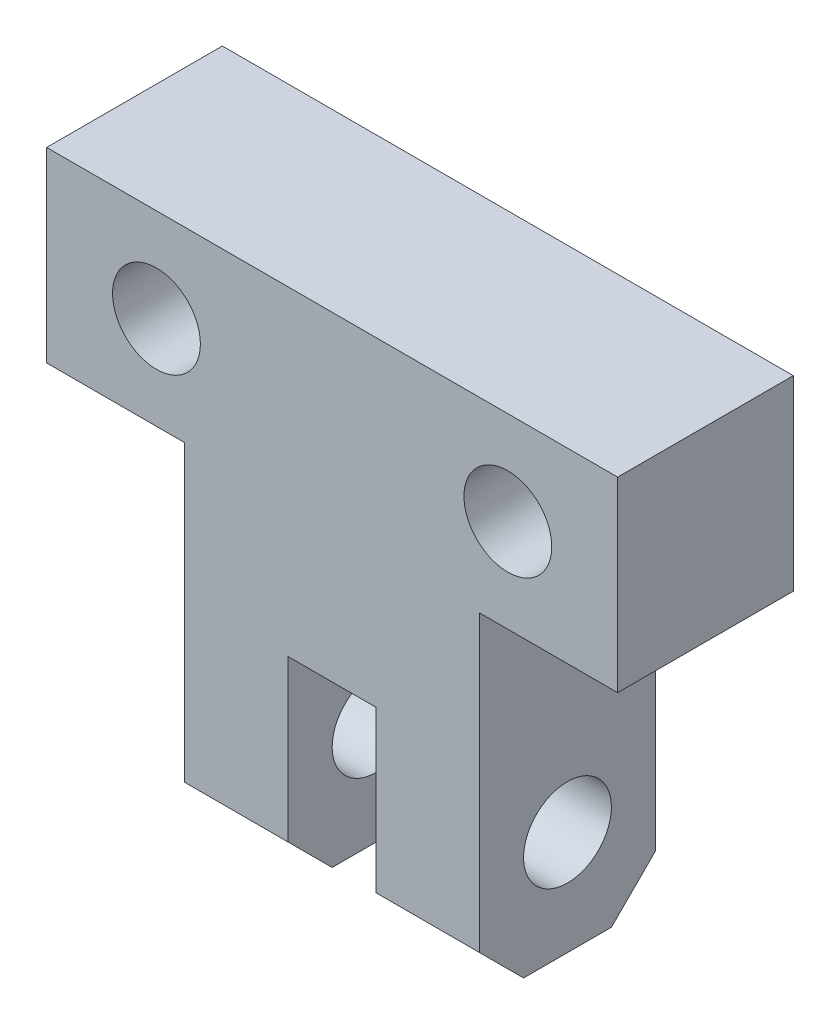
ISO-10303-21;
HEADER;
FILE_DESCRIPTION(('STEP AP214'),'2;1');
FILE_NAME('part.step','',(''),(''),'','','');
FILE_SCHEMA(('AUTOMOTIVE_DESIGN { 1 0 10303 214 1 1 1 1 }'));
ENDSEC;
DATA;
#1=APPLICATION_CONTEXT('core data for automotive mechanical design processes');
#2=APPLICATION_PROTOCOL_DEFINITION('international standard','automotive_design',2000,#1);
#3=PRODUCT_CONTEXT('',#1,'mechanical');
#4=PRODUCT('Part','Part','',(#3));
#5=PRODUCT_RELATED_PRODUCT_CATEGORY('part','',(#4));
#6=PRODUCT_DEFINITION_FORMATION('','',#4);
#7=PRODUCT_DEFINITION_CONTEXT('part definition',#1,'design');
#8=PRODUCT_DEFINITION('design','',#6,#7);
#9=PRODUCT_DEFINITION_SHAPE('','',#8);
#10=(LENGTH_UNIT() NAMED_UNIT(*) SI_UNIT(.MILLI.,.METRE.));
#11=(NAMED_UNIT(*) PLANE_ANGLE_UNIT() SI_UNIT($,.RADIAN.));
#12=(NAMED_UNIT(*) SI_UNIT($,.STERADIAN.) SOLID_ANGLE_UNIT());
#13=UNCERTAINTY_MEASURE_WITH_UNIT(LENGTH_MEASURE(1.E-05),#10,'distance_accuracy_value','');
#14=(GEOMETRIC_REPRESENTATION_CONTEXT(3) GLOBAL_UNCERTAINTY_ASSIGNED_CONTEXT((#13)) GLOBAL_UNIT_ASSIGNED_CONTEXT((#10,
#11,#12)) REPRESENTATION_CONTEXT('',''));
#15=CARTESIAN_POINT('',(0.,0.,0.));
#16=DIRECTION('',(0.,0.,1.));
#17=DIRECTION('',(1.,0.,0.));
#18=AXIS2_PLACEMENT_3D('',#15,#16,#17);
#19=CARTESIAN_POINT('',(6.71626696282154,-8.89449990548741,8.));
#20=DIRECTION('',(-1.,0.,0.));
#21=DIRECTION('',(0.,0.,1.));
#22=AXIS2_PLACEMENT_3D('',#19,#20,#21);
#23=PLANE('',#22);
#24=CARTESIAN_POINT('',(6.71626696282154,-4.14834477972548,4.));
#25=DIRECTION('',(1.,0.,0.));
#26=DIRECTION('',(0.,0.,-1.));
#27=AXIS2_PLACEMENT_3D('',#24,#25,#26);
#28=CIRCLE('',#27,2.);
#29=CARTESIAN_POINT('',(6.71626696282154,-4.14834477972548,2.));
#30=VERTEX_POINT('',#29);
#31=EDGE_CURVE('E180',#30,#30,#28,.T.);
#32=ORIENTED_EDGE('',*,*,#31,.F.);
#33=EDGE_LOOP('',(#32));
#34=FACE_BOUND('',#33,.T.);
#35=DIRECTION('',(0.,1.,0.));
#36=VECTOR('',#35,1.);
#37=CARTESIAN_POINT('',(6.71626696282154,-8.89449990548741,8.));
#38=LINE('',#37,#36);
#39=CARTESIAN_POINT('',(6.71626696282154,-6.89449990548741,8.));
#40=VERTEX_POINT('',#39);
#41=CARTESIAN_POINT('',(6.71626696282154,6.50000000239778,8.));
#42=VERTEX_POINT('',#41);
#43=EDGE_CURVE('E146',#40,#42,#38,.T.);
#44=ORIENTED_EDGE('',*,*,#43,.F.);
#45=DIRECTION('',(0.,0.707106781186546,0.707106781186549));
#46=VECTOR('',#45,1.);
#47=CARTESIAN_POINT('',(6.71626696282154,-6.89449990548741,8.));
#48=LINE('',#47,#46);
#49=CARTESIAN_POINT('',(6.71626696282154,-8.89449990548741,6.));
#50=VERTEX_POINT('',#49);
#51=EDGE_CURVE('E199',#40,#50,#48,.F.);
#52=ORIENTED_EDGE('',*,*,#51,.T.);
#53=DIRECTION('',(0.,0.,-1.));
#54=VECTOR('',#53,1.);
#55=CARTESIAN_POINT('',(6.71626696282154,-8.89449990548741,8.));
#56=LINE('',#55,#54);
#57=CARTESIAN_POINT('',(6.71626696282154,-8.89449990548741,1.99999999999999));
#58=VERTEX_POINT('',#57);
#59=EDGE_CURVE('E219',#50,#58,#56,.T.);
#60=ORIENTED_EDGE('',*,*,#59,.T.);
#61=DIRECTION('',(0.,0.707106781186549,-0.707106781186546));
#62=VECTOR('',#61,1.);
#63=CARTESIAN_POINT('',(6.71626696282154,-8.89449990548741,1.99999999999999));
#64=LINE('',#63,#62);
#65=CARTESIAN_POINT('',(6.71626696282154,-6.89449990548741,0.));
#66=VERTEX_POINT('',#65);
#67=EDGE_CURVE('E197',#58,#66,#64,.T.);
#68=ORIENTED_EDGE('',*,*,#67,.T.);
#69=DIRECTION('',(0.,1.,0.));
#70=VECTOR('',#69,1.);
#71=CARTESIAN_POINT('',(6.71626696282154,-8.89449990548741,0.));
#72=LINE('',#71,#70);
#73=CARTESIAN_POINT('',(6.71626696282154,6.50000000239778,0.));
#74=VERTEX_POINT('',#73);
#75=EDGE_CURVE('E168',#66,#74,#72,.T.);
#76=ORIENTED_EDGE('',*,*,#75,.T.);
#77=DIRECTION('',(0.,0.,-1.));
#78=VECTOR('',#77,1.);
#79=CARTESIAN_POINT('',(6.71626696282154,6.50000000239778,8.));
#80=LINE('',#79,#78);
#81=EDGE_CURVE('E162',#42,#74,#80,.T.);
#82=ORIENTED_EDGE('',*,*,#81,.F.);
#83=EDGE_LOOP('',(#44,#52,#60,#68,#76,#82));
#84=FACE_BOUND('',#83,.T.);
#85=ADVANCED_FACE('F32',(#34,#84),#23,.F.);
#86=CARTESIAN_POINT('',(6.71626696282154,6.50000000239778,8.));
#87=DIRECTION('',(0.,1.,0.));
#88=DIRECTION('',(-1.,0.,0.));
#89=AXIS2_PLACEMENT_3D('',#86,#87,#88);
#90=PLANE('',#89);
#91=DIRECTION('',(1.,0.,0.));
#92=VECTOR('',#91,1.);
#93=CARTESIAN_POINT('',(6.71626696282154,6.50000000239778,0.));
#94=LINE('',#93,#92);
#95=CARTESIAN_POINT('',(13.,6.50000000239777,0.));
#96=VERTEX_POINT('',#95);
#97=EDGE_CURVE('E271',#74,#96,#94,.T.);
#98=ORIENTED_EDGE('',*,*,#97,.T.);
#99=DIRECTION('',(0.,0.,-1.));
#100=VECTOR('',#99,1.);
#101=CARTESIAN_POINT('',(13.,6.50000000239777,8.));
#102=LINE('',#101,#100);
#103=CARTESIAN_POINT('',(13.,6.50000000239777,8.));
#104=VERTEX_POINT('',#103);
#105=EDGE_CURVE('E164',#104,#96,#102,.T.);
#106=ORIENTED_EDGE('',*,*,#105,.F.);
#107=DIRECTION('',(1.,0.,0.));
#108=VECTOR('',#107,1.);
#109=CARTESIAN_POINT('',(6.71626696282154,6.50000000239778,8.));
#110=LINE('',#109,#108);
#111=EDGE_CURVE('E150',#42,#104,#110,.T.);
#112=ORIENTED_EDGE('',*,*,#111,.F.);
#113=ORIENTED_EDGE('',*,*,#81,.T.);
#114=EDGE_LOOP('',(#98,#106,#112,#113));
#115=FACE_BOUND('',#114,.T.);
#116=ADVANCED_FACE('F161',(#115),#90,.F.);
#117=CARTESIAN_POINT('',(13.,15.,8.));
#118=DIRECTION('',(-1.,0.,0.));
#119=DIRECTION('',(0.,0.,1.));
#120=AXIS2_PLACEMENT_3D('',#117,#118,#119);
#121=PLANE('',#120);
#122=DIRECTION('',(0.,1.,0.));
#123=VECTOR('',#122,1.);
#124=CARTESIAN_POINT('',(13.,15.,0.));
#125=LINE('',#124,#123);
#126=CARTESIAN_POINT('',(13.,15.,0.));
#127=VERTEX_POINT('',#126);
#128=EDGE_CURVE('E265',#96,#127,#125,.T.);
#129=ORIENTED_EDGE('',*,*,#128,.T.);
#130=DIRECTION('',(0.,0.,-1.));
#131=VECTOR('',#130,1.);
#132=CARTESIAN_POINT('',(13.,15.,8.));
#133=LINE('',#132,#131);
#134=CARTESIAN_POINT('',(13.,15.,8.));
#135=VERTEX_POINT('',#134);
#136=EDGE_CURVE('E173',#135,#127,#133,.T.);
#137=ORIENTED_EDGE('',*,*,#136,.F.);
#138=DIRECTION('',(0.,1.,0.));
#139=VECTOR('',#138,1.);
#140=CARTESIAN_POINT('',(13.,15.,8.));
#141=LINE('',#140,#139);
#142=EDGE_CURVE('E166',#104,#135,#141,.T.);
#143=ORIENTED_EDGE('',*,*,#142,.F.);
#144=ORIENTED_EDGE('',*,*,#105,.T.);
#145=EDGE_LOOP('',(#129,#137,#143,#144));
#146=FACE_BOUND('',#145,.T.);
#147=ADVANCED_FACE('F325',(#146),#121,.F.);
#148=CARTESIAN_POINT('',(-13.,15.,8.));
#149=DIRECTION('',(0.,-1.,0.));
#150=DIRECTION('',(0.,0.,-1.));
#151=AXIS2_PLACEMENT_3D('',#148,#149,#150);
#152=PLANE('',#151);
#153=DIRECTION('',(-1.,0.,0.));
#154=VECTOR('',#153,1.);
#155=CARTESIAN_POINT('',(-13.,15.,0.));
#156=LINE('',#155,#154);
#157=CARTESIAN_POINT('',(-13.,15.,0.));
#158=VERTEX_POINT('',#157);
#159=EDGE_CURVE('E258',#127,#158,#156,.T.);
#160=ORIENTED_EDGE('',*,*,#159,.T.);
#161=DIRECTION('',(0.,0.,-1.));
#162=VECTOR('',#161,1.);
#163=CARTESIAN_POINT('',(-13.,15.,8.));
#164=LINE('',#163,#162);
#165=CARTESIAN_POINT('',(-13.,15.,8.));
#166=VERTEX_POINT('',#165);
#167=EDGE_CURVE('E249',#166,#158,#164,.T.);
#168=ORIENTED_EDGE('',*,*,#167,.F.);
#169=DIRECTION('',(-1.,0.,0.));
#170=VECTOR('',#169,1.);
#171=CARTESIAN_POINT('',(-13.,15.,8.));
#172=LINE('',#171,#170);
#173=EDGE_CURVE('E259',#135,#166,#172,.T.);
#174=ORIENTED_EDGE('',*,*,#173,.F.);
#175=ORIENTED_EDGE('',*,*,#136,.T.);
#176=EDGE_LOOP('',(#160,#168,#174,#175));
#177=FACE_BOUND('',#176,.T.);
#178=ADVANCED_FACE('F256',(#177),#152,.F.);
#179=CARTESIAN_POINT('',(-13.,15.,8.));
#180=DIRECTION('',(1.,0.,0.));
#181=DIRECTION('',(0.,0.,-1.));
#182=AXIS2_PLACEMENT_3D('',#179,#180,#181);
#183=PLANE('',#182);
#184=DIRECTION('',(0.,-1.,0.));
#185=VECTOR('',#184,1.);
#186=CARTESIAN_POINT('',(-13.,15.,0.));
#187=LINE('',#186,#185);
#188=CARTESIAN_POINT('',(-13.,6.50000000239777,0.));
#189=VERTEX_POINT('',#188);
#190=EDGE_CURVE('E267',#158,#189,#187,.T.);
#191=ORIENTED_EDGE('',*,*,#190,.T.);
#192=DIRECTION('',(0.,0.,-1.));
#193=VECTOR('',#192,1.);
#194=CARTESIAN_POINT('',(-13.,6.50000000239777,8.));
#195=LINE('',#194,#193);
#196=CARTESIAN_POINT('',(-13.,6.50000000239777,8.));
#197=VERTEX_POINT('',#196);
#198=EDGE_CURVE('E246',#197,#189,#195,.T.);
#199=ORIENTED_EDGE('',*,*,#198,.F.);
#200=DIRECTION('',(0.,-1.,0.));
#201=VECTOR('',#200,1.);
#202=CARTESIAN_POINT('',(-13.,15.,8.));
#203=LINE('',#202,#201);
#204=EDGE_CURVE('E297',#166,#197,#203,.T.);
#205=ORIENTED_EDGE('',*,*,#204,.F.);
#206=ORIENTED_EDGE('',*,*,#167,.T.);
#207=EDGE_LOOP('',(#191,#199,#205,#206));
#208=FACE_BOUND('',#207,.T.);
#209=ADVANCED_FACE('F385',(#208),#183,.F.);
#210=CARTESIAN_POINT('',(-6.71626696282154,6.50000000239778,8.));
#211=DIRECTION('',(0.,1.,0.));
#212=DIRECTION('',(-1.,0.,0.));
#213=AXIS2_PLACEMENT_3D('',#210,#211,#212);
#214=PLANE('',#213);
#215=DIRECTION('',(1.,0.,0.));
#216=VECTOR('',#215,1.);
#217=CARTESIAN_POINT('',(-6.71626696282154,6.50000000239778,0.));
#218=LINE('',#217,#216);
#219=CARTESIAN_POINT('',(-6.71626696282154,6.50000000239778,0.));
#220=VERTEX_POINT('',#219);
#221=EDGE_CURVE('E269',#189,#220,#218,.T.);
#222=ORIENTED_EDGE('',*,*,#221,.T.);
#223=DIRECTION('',(0.,0.,-1.));
#224=VECTOR('',#223,1.);
#225=CARTESIAN_POINT('',(-6.71626696282154,6.50000000239778,8.));
#226=LINE('',#225,#224);
#227=CARTESIAN_POINT('',(-6.71626696282154,6.50000000239778,8.));
#228=VERTEX_POINT('',#227);
#229=EDGE_CURVE('E243',#228,#220,#226,.T.);
#230=ORIENTED_EDGE('',*,*,#229,.F.);
#231=DIRECTION('',(1.,0.,0.));
#232=VECTOR('',#231,1.);
#233=CARTESIAN_POINT('',(-6.71626696282154,6.50000000239778,8.));
#234=LINE('',#233,#232);
#235=EDGE_CURVE('E295',#197,#228,#234,.T.);
#236=ORIENTED_EDGE('',*,*,#235,.F.);
#237=ORIENTED_EDGE('',*,*,#198,.T.);
#238=EDGE_LOOP('',(#222,#230,#236,#237));
#239=FACE_BOUND('',#238,.T.);
#240=ADVANCED_FACE('F361',(#239),#214,.F.);
#241=CARTESIAN_POINT('',(-6.71626696282154,-8.89449990548741,8.));
#242=DIRECTION('',(1.,0.,0.));
#243=DIRECTION('',(0.,0.,-1.));
#244=AXIS2_PLACEMENT_3D('',#241,#242,#243);
#245=PLANE('',#244);
#246=CARTESIAN_POINT('',(-6.71626696282154,-4.14834477972548,4.));
#247=DIRECTION('',(1.,0.,0.));
#248=DIRECTION('',(0.,0.,-1.));
#249=AXIS2_PLACEMENT_3D('',#246,#247,#248);
#250=CIRCLE('',#249,2.);
#251=CARTESIAN_POINT('',(-6.71626696282154,-4.14834477972548,2.));
#252=VERTEX_POINT('',#251);
#253=EDGE_CURVE('E307',#252,#252,#250,.T.);
#254=ORIENTED_EDGE('',*,*,#253,.T.);
#255=EDGE_LOOP('',(#254));
#256=FACE_BOUND('',#255,.T.);
#257=DIRECTION('',(0.,0.,-1.));
#258=VECTOR('',#257,1.);
#259=CARTESIAN_POINT('',(-6.71626696282154,-8.89449990548741,8.));
#260=LINE('',#259,#258);
#261=CARTESIAN_POINT('',(-6.71626696282154,-8.89449990548741,6.));
#262=VERTEX_POINT('',#261);
#263=CARTESIAN_POINT('',(-6.71626696282154,-8.89449990548741,1.99999999999999));
#264=VERTEX_POINT('',#263);
#265=EDGE_CURVE('E240',#262,#264,#260,.T.);
#266=ORIENTED_EDGE('',*,*,#265,.F.);
#267=DIRECTION('',(0.,-0.707106781186546,-0.707106781186549));
#268=VECTOR('',#267,1.);
#269=CARTESIAN_POINT('',(-6.71626696282154,-6.89449990548741,8.));
#270=LINE('',#269,#268);
#271=CARTESIAN_POINT('',(-6.71626696282154,-6.89449990548741,8.));
#272=VERTEX_POINT('',#271);
#273=EDGE_CURVE('E195',#262,#272,#270,.F.);
#274=ORIENTED_EDGE('',*,*,#273,.T.);
#275=DIRECTION('',(0.,-1.,0.));
#276=VECTOR('',#275,1.);
#277=CARTESIAN_POINT('',(-6.71626696282154,-8.89449990548741,8.));
#278=LINE('',#277,#276);
#279=EDGE_CURVE('E293',#228,#272,#278,.T.);
#280=ORIENTED_EDGE('',*,*,#279,.F.);
#281=ORIENTED_EDGE('',*,*,#229,.T.);
#282=DIRECTION('',(0.,-1.,0.));
#283=VECTOR('',#282,1.);
#284=CARTESIAN_POINT('',(-6.71626696282154,-8.89449990548741,0.));
#285=LINE('',#284,#283);
#286=CARTESIAN_POINT('',(-6.71626696282154,-6.89449990548741,0.));
#287=VERTEX_POINT('',#286);
#288=EDGE_CURVE('E276',#220,#287,#285,.T.);
#289=ORIENTED_EDGE('',*,*,#288,.T.);
#290=DIRECTION('',(0.,-0.707106781186549,0.707106781186546));
#291=VECTOR('',#290,1.);
#292=CARTESIAN_POINT('',(-6.71626696282154,-8.89449990548741,1.99999999999999));
#293=LINE('',#292,#291);
#294=EDGE_CURVE('E193',#287,#264,#293,.T.);
#295=ORIENTED_EDGE('',*,*,#294,.T.);
#296=EDGE_LOOP('',(#266,#274,#280,#281,#289,#295));
#297=FACE_BOUND('',#296,.T.);
#298=ADVANCED_FACE('F346',(#256,#297),#245,.F.);
#299=CARTESIAN_POINT('',(-6.71626696282154,-8.89449990548741,8.));
#300=DIRECTION('',(0.,1.,0.));
#301=DIRECTION('',(0.,0.,1.));
#302=AXIS2_PLACEMENT_3D('',#299,#300,#301);
#303=PLANE('',#302);
#304=DIRECTION('',(0.,0.,-1.));
#305=VECTOR('',#304,1.);
#306=CARTESIAN_POINT('',(-2.,-8.89449990548741,8.));
#307=LINE('',#306,#305);
#308=CARTESIAN_POINT('',(-2.,-8.89449990548741,6.));
#309=VERTEX_POINT('',#308);
#310=CARTESIAN_POINT('',(-2.,-8.89449990548741,1.99999999999999));
#311=VERTEX_POINT('',#310);
#312=EDGE_CURVE('E237',#309,#311,#307,.T.);
#313=ORIENTED_EDGE('',*,*,#312,.F.);
#314=DIRECTION('',(-1.,0.,0.));
#315=VECTOR('',#314,1.);
#316=CARTESIAN_POINT('',(-6.71626696282154,-8.89449990548741,6.));
#317=LINE('',#316,#315);
#318=EDGE_CURVE('E191',#309,#262,#317,.T.);
#319=ORIENTED_EDGE('',*,*,#318,.T.);
#320=ORIENTED_EDGE('',*,*,#265,.T.);
#321=DIRECTION('',(1.,0.,0.));
#322=VECTOR('',#321,1.);
#323=CARTESIAN_POINT('',(-2.,-8.89449990548741,1.99999999999999));
#324=LINE('',#323,#322);
#325=EDGE_CURVE('E188',#264,#311,#324,.T.);
#326=ORIENTED_EDGE('',*,*,#325,.T.);
#327=EDGE_LOOP('',(#313,#319,#320,#326));
#328=FACE_BOUND('',#327,.T.);
#329=ADVANCED_FACE('F351',(#328),#303,.F.);
#330=CARTESIAN_POINT('',(-2.,-8.89449990548741,8.));
#331=DIRECTION('',(-1.,0.,0.));
#332=DIRECTION('',(0.,0.,1.));
#333=AXIS2_PLACEMENT_3D('',#330,#331,#332);
#334=PLANE('',#333);
#335=CARTESIAN_POINT('',(-2.,-4.14834477972548,4.));
#336=DIRECTION('',(-1.,0.,0.));
#337=DIRECTION('',(0.,0.,1.));
#338=AXIS2_PLACEMENT_3D('',#335,#336,#337);
#339=CIRCLE('',#338,2.);
#340=CARTESIAN_POINT('',(-2.,-4.14834477972548,6.));
#341=VERTEX_POINT('',#340);
#342=EDGE_CURVE('E179',#341,#341,#339,.T.);
#343=ORIENTED_EDGE('',*,*,#342,.T.);
#344=EDGE_LOOP('',(#343));
#345=FACE_BOUND('',#344,.T.);
#346=DIRECTION('',(0.,1.,0.));
#347=VECTOR('',#346,1.);
#348=CARTESIAN_POINT('',(-2.,-8.89449990548741,8.));
#349=LINE('',#348,#347);
#350=CARTESIAN_POINT('',(-2.,-6.89449990548741,8.));
#351=VERTEX_POINT('',#350);
#352=CARTESIAN_POINT('',(-2.,0.421288839767442,8.));
#353=VERTEX_POINT('',#352);
#354=EDGE_CURVE('E291',#351,#353,#349,.T.);
#355=ORIENTED_EDGE('',*,*,#354,.F.);
#356=DIRECTION('',(0.,0.707106781186546,0.707106781186549));
#357=VECTOR('',#356,1.);
#358=CARTESIAN_POINT('',(-2.,-6.89449990548741,8.));
#359=LINE('',#358,#357);
#360=EDGE_CURVE('E186',#351,#309,#359,.F.);
#361=ORIENTED_EDGE('',*,*,#360,.T.);
#362=ORIENTED_EDGE('',*,*,#312,.T.);
#363=DIRECTION('',(0.,0.707106781186549,-0.707106781186546));
#364=VECTOR('',#363,1.);
#365=CARTESIAN_POINT('',(-2.,-8.89449990548741,1.99999999999999));
#366=LINE('',#365,#364);
#367=CARTESIAN_POINT('',(-2.,-6.89449990548741,0.));
#368=VERTEX_POINT('',#367);
#369=EDGE_CURVE('E184',#311,#368,#366,.T.);
#370=ORIENTED_EDGE('',*,*,#369,.T.);
#371=DIRECTION('',(0.,1.,0.));
#372=VECTOR('',#371,1.);
#373=CARTESIAN_POINT('',(-2.,-8.89449990548741,0.));
#374=LINE('',#373,#372);
#375=CARTESIAN_POINT('',(-2.,0.421288839767442,0.));
#376=VERTEX_POINT('',#375);
#377=EDGE_CURVE('E279',#368,#376,#374,.T.);
#378=ORIENTED_EDGE('',*,*,#377,.T.);
#379=DIRECTION('',(0.,0.,-1.));
#380=VECTOR('',#379,1.);
#381=CARTESIAN_POINT('',(-2.,0.421288839767442,8.));
#382=LINE('',#381,#380);
#383=EDGE_CURVE('E234',#353,#376,#382,.T.);
#384=ORIENTED_EDGE('',*,*,#383,.F.);
#385=EDGE_LOOP('',(#355,#361,#362,#370,#378,#384));
#386=FACE_BOUND('',#385,.T.);
#387=ADVANCED_FACE('F364',(#345,#386),#334,.F.);
#388=CARTESIAN_POINT('',(2.,0.421288839767442,8.));
#389=DIRECTION('',(0.,1.,0.));
#390=DIRECTION('',(0.,0.,1.));
#391=AXIS2_PLACEMENT_3D('',#388,#389,#390);
#392=PLANE('',#391);
#393=DIRECTION('',(1.,0.,0.));
#394=VECTOR('',#393,1.);
#395=CARTESIAN_POINT('',(2.,0.421288839767442,0.));
#396=LINE('',#395,#394);
#397=CARTESIAN_POINT('',(2.,0.421288839767442,0.));
#398=VERTEX_POINT('',#397);
#399=EDGE_CURVE('E280',#376,#398,#396,.T.);
#400=ORIENTED_EDGE('',*,*,#399,.T.);
#401=DIRECTION('',(0.,0.,-1.));
#402=VECTOR('',#401,1.);
#403=CARTESIAN_POINT('',(2.,0.421288839767442,8.));
#404=LINE('',#403,#402);
#405=CARTESIAN_POINT('',(2.,0.421288839767442,8.));
#406=VERTEX_POINT('',#405);
#407=EDGE_CURVE('E228',#406,#398,#404,.T.);
#408=ORIENTED_EDGE('',*,*,#407,.F.);
#409=DIRECTION('',(1.,0.,0.));
#410=VECTOR('',#409,1.);
#411=CARTESIAN_POINT('',(2.,0.421288839767442,8.));
#412=LINE('',#411,#410);
#413=EDGE_CURVE('E217',#353,#406,#412,.T.);
#414=ORIENTED_EDGE('',*,*,#413,.F.);
#415=ORIENTED_EDGE('',*,*,#383,.T.);
#416=EDGE_LOOP('',(#400,#408,#414,#415));
#417=FACE_BOUND('',#416,.T.);
#418=ADVANCED_FACE('F365',(#417),#392,.F.);
#419=CARTESIAN_POINT('',(2.,-8.89449990548741,8.));
#420=DIRECTION('',(1.,0.,0.));
#421=DIRECTION('',(0.,0.,-1.));
#422=AXIS2_PLACEMENT_3D('',#419,#420,#421);
#423=PLANE('',#422);
#424=CARTESIAN_POINT('',(2.,-4.14834477972548,4.));
#425=DIRECTION('',(1.,0.,0.));
#426=DIRECTION('',(0.,0.,-1.));
#427=AXIS2_PLACEMENT_3D('',#424,#425,#426);
#428=CIRCLE('',#427,2.);
#429=CARTESIAN_POINT('',(2.,-4.14834477972548,2.));
#430=VERTEX_POINT('',#429);
#431=EDGE_CURVE('E177',#430,#430,#428,.T.);
#432=ORIENTED_EDGE('',*,*,#431,.T.);
#433=EDGE_LOOP('',(#432));
#434=FACE_BOUND('',#433,.T.);
#435=DIRECTION('',(0.,0.,-1.));
#436=VECTOR('',#435,1.);
#437=CARTESIAN_POINT('',(2.,-8.89449990548741,8.));
#438=LINE('',#437,#436);
#439=CARTESIAN_POINT('',(2.,-8.89449990548741,6.));
#440=VERTEX_POINT('',#439);
#441=CARTESIAN_POINT('',(2.,-8.89449990548741,1.99999999999999));
#442=VERTEX_POINT('',#441);
#443=EDGE_CURVE('E213',#440,#442,#438,.T.);
#444=ORIENTED_EDGE('',*,*,#443,.F.);
#445=DIRECTION('',(0.,-0.707106781186546,-0.707106781186549));
#446=VECTOR('',#445,1.);
#447=CARTESIAN_POINT('',(2.,-6.89449990548741,8.));
#448=LINE('',#447,#446);
#449=CARTESIAN_POINT('',(2.,-6.89449990548741,8.));
#450=VERTEX_POINT('',#449);
#451=EDGE_CURVE('E207',#440,#450,#448,.F.);
#452=ORIENTED_EDGE('',*,*,#451,.T.);
#453=DIRECTION('',(0.,-1.,0.));
#454=VECTOR('',#453,1.);
#455=CARTESIAN_POINT('',(2.,-8.89449990548741,8.));
#456=LINE('',#455,#454);
#457=EDGE_CURVE('E212',#406,#450,#456,.T.);
#458=ORIENTED_EDGE('',*,*,#457,.F.);
#459=ORIENTED_EDGE('',*,*,#407,.T.);
#460=DIRECTION('',(0.,-1.,0.));
#461=VECTOR('',#460,1.);
#462=CARTESIAN_POINT('',(2.,-8.89449990548741,0.));
#463=LINE('',#462,#461);
#464=CARTESIAN_POINT('',(2.,-6.89449990548741,0.));
#465=VERTEX_POINT('',#464);
#466=EDGE_CURVE('E157',#398,#465,#463,.T.);
#467=ORIENTED_EDGE('',*,*,#466,.T.);
#468=DIRECTION('',(0.,-0.707106781186549,0.707106781186546));
#469=VECTOR('',#468,1.);
#470=CARTESIAN_POINT('',(2.,-8.89449990548741,1.99999999999999));
#471=LINE('',#470,#469);
#472=EDGE_CURVE('E53',#465,#442,#471,.T.);
#473=ORIENTED_EDGE('',*,*,#472,.T.);
#474=EDGE_LOOP('',(#444,#452,#458,#459,#467,#473));
#475=FACE_BOUND('',#474,.T.);
#476=ADVANCED_FACE('F210',(#434,#475),#423,.F.);
#477=CARTESIAN_POINT('',(6.71626696282154,-8.89449990548741,8.));
#478=DIRECTION('',(0.,1.,0.));
#479=DIRECTION('',(0.,0.,1.));
#480=AXIS2_PLACEMENT_3D('',#477,#478,#479);
#481=PLANE('',#480);
#482=ORIENTED_EDGE('',*,*,#59,.F.);
#483=DIRECTION('',(-1.,0.,0.));
#484=VECTOR('',#483,1.);
#485=CARTESIAN_POINT('',(6.71626696282154,-8.89449990548741,6.));
#486=LINE('',#485,#484);
#487=EDGE_CURVE('E204',#50,#440,#486,.T.);
#488=ORIENTED_EDGE('',*,*,#487,.T.);
#489=ORIENTED_EDGE('',*,*,#443,.T.);
#490=DIRECTION('',(1.,0.,0.));
#491=VECTOR('',#490,1.);
#492=CARTESIAN_POINT('',(6.71626696282154,-8.89449990548741,1.99999999999999));
#493=LINE('',#492,#491);
#494=EDGE_CURVE('E201',#442,#58,#493,.T.);
#495=ORIENTED_EDGE('',*,*,#494,.T.);
#496=EDGE_LOOP('',(#482,#488,#489,#495));
#497=FACE_BOUND('',#496,.T.);
#498=ADVANCED_FACE('F225',(#497),#481,.F.);
#499=CARTESIAN_POINT('',(6.71626696282154,6.50000000239778,8.));
#500=DIRECTION('',(0.,0.,-1.));
#501=DIRECTION('',(-1.,0.,0.));
#502=AXIS2_PLACEMENT_3D('',#499,#500,#501);
#503=PLANE('',#502);
#504=CARTESIAN_POINT('',(8.,10.7500000011989,8.));
#505=DIRECTION('',(0.,0.,1.));
#506=DIRECTION('',(1.,0.,0.));
#507=AXIS2_PLACEMENT_3D('',#504,#505,#506);
#508=CIRCLE('',#507,2.);
#509=CARTESIAN_POINT('',(10.,10.7500000011989,8.));
#510=VERTEX_POINT('',#509);
#511=EDGE_CURVE('E304',#510,#510,#508,.T.);
#512=ORIENTED_EDGE('',*,*,#511,.F.);
#513=EDGE_LOOP('',(#512));
#514=FACE_BOUND('',#513,.T.);
#515=CARTESIAN_POINT('',(-8.,10.7484982255958,8.));
#516=DIRECTION('',(0.,0.,1.));
#517=DIRECTION('',(1.,0.,0.));
#518=AXIS2_PLACEMENT_3D('',#515,#516,#517);
#519=CIRCLE('',#518,2.);
#520=CARTESIAN_POINT('',(-6.,10.7484982255958,8.));
#521=VERTEX_POINT('',#520);
#522=EDGE_CURVE('E287',#521,#521,#519,.T.);
#523=ORIENTED_EDGE('',*,*,#522,.F.);
#524=EDGE_LOOP('',(#523));
#525=FACE_BOUND('',#524,.T.);
#526=ORIENTED_EDGE('',*,*,#279,.T.);
#527=DIRECTION('',(1.,0.,0.));
#528=VECTOR('',#527,1.);
#529=CARTESIAN_POINT('',(6.71626696282154,-6.89449990548741,8.));
#530=LINE('',#529,#528);
#531=EDGE_CURVE('E171',#272,#351,#530,.T.);
#532=ORIENTED_EDGE('',*,*,#531,.T.);
#533=ORIENTED_EDGE('',*,*,#354,.T.);
#534=ORIENTED_EDGE('',*,*,#413,.T.);
#535=ORIENTED_EDGE('',*,*,#457,.T.);
#536=DIRECTION('',(1.,0.,0.));
#537=VECTOR('',#536,1.);
#538=CARTESIAN_POINT('',(6.71626696282154,-6.89449990548741,8.));
#539=LINE('',#538,#537);
#540=EDGE_CURVE('E154',#450,#40,#539,.T.);
#541=ORIENTED_EDGE('',*,*,#540,.T.);
#542=ORIENTED_EDGE('',*,*,#43,.T.);
#543=ORIENTED_EDGE('',*,*,#111,.T.);
#544=ORIENTED_EDGE('',*,*,#142,.T.);
#545=ORIENTED_EDGE('',*,*,#173,.T.);
#546=ORIENTED_EDGE('',*,*,#204,.T.);
#547=ORIENTED_EDGE('',*,*,#235,.T.);
#548=EDGE_LOOP('',(#526,#532,#533,#534,#535,#541,#542,#543,#544,#545,#546,#547));
#549=FACE_BOUND('',#548,.T.);
#550=ADVANCED_FACE('F149',(#514,#525,#549),#503,.F.);
#551=CARTESIAN_POINT('',(6.71626696282154,6.50000000239778,0.));
#552=DIRECTION('',(0.,0.,-1.));
#553=DIRECTION('',(-1.,0.,0.));
#554=AXIS2_PLACEMENT_3D('',#551,#552,#553);
#555=PLANE('',#554);
#556=CARTESIAN_POINT('',(8.,10.7500000011989,0.));
#557=DIRECTION('',(0.,0.,1.));
#558=DIRECTION('',(1.,0.,0.));
#559=AXIS2_PLACEMENT_3D('',#556,#557,#558);
#560=CIRCLE('',#559,2.);
#561=CARTESIAN_POINT('',(10.,10.7500000011989,0.));
#562=VERTEX_POINT('',#561);
#563=EDGE_CURVE('E302',#562,#562,#560,.T.);
#564=ORIENTED_EDGE('',*,*,#563,.T.);
#565=EDGE_LOOP('',(#564));
#566=FACE_BOUND('',#565,.T.);
#567=CARTESIAN_POINT('',(-8.,10.7484982255958,0.));
#568=DIRECTION('',(0.,0.,1.));
#569=DIRECTION('',(1.,0.,0.));
#570=AXIS2_PLACEMENT_3D('',#567,#568,#569);
#571=CIRCLE('',#570,2.);
#572=CARTESIAN_POINT('',(-6.,10.7484982255958,0.));
#573=VERTEX_POINT('',#572);
#574=EDGE_CURVE('E284',#573,#573,#571,.T.);
#575=ORIENTED_EDGE('',*,*,#574,.T.);
#576=EDGE_LOOP('',(#575));
#577=FACE_BOUND('',#576,.T.);
#578=ORIENTED_EDGE('',*,*,#377,.F.);
#579=DIRECTION('',(-1.,0.,0.));
#580=VECTOR('',#579,1.);
#581=CARTESIAN_POINT('',(-6.71626696282154,-6.89449990548741,0.));
#582=LINE('',#581,#580);
#583=EDGE_CURVE('E11',#368,#287,#582,.T.);
#584=ORIENTED_EDGE('',*,*,#583,.T.);
#585=ORIENTED_EDGE('',*,*,#288,.F.);
#586=ORIENTED_EDGE('',*,*,#221,.F.);
#587=ORIENTED_EDGE('',*,*,#190,.F.);
#588=ORIENTED_EDGE('',*,*,#159,.F.);
#589=ORIENTED_EDGE('',*,*,#128,.F.);
#590=ORIENTED_EDGE('',*,*,#97,.F.);
#591=ORIENTED_EDGE('',*,*,#75,.F.);
#592=DIRECTION('',(-1.,0.,0.));
#593=VECTOR('',#592,1.);
#594=CARTESIAN_POINT('',(2.,-6.89449990548741,0.));
#595=LINE('',#594,#593);
#596=EDGE_CURVE('E40',#66,#465,#595,.T.);
#597=ORIENTED_EDGE('',*,*,#596,.T.);
#598=ORIENTED_EDGE('',*,*,#466,.F.);
#599=ORIENTED_EDGE('',*,*,#399,.F.);
#600=EDGE_LOOP('',(#578,#584,#585,#586,#587,#588,#589,#590,#591,#597,#598,#599));
#601=FACE_BOUND('',#600,.T.);
#602=ADVANCED_FACE('F264',(#566,#577,#601),#555,.T.);
#603=CARTESIAN_POINT('',(-8.,10.7484982255958,0.));
#604=DIRECTION('',(0.,0.,1.));
#605=DIRECTION('',(1.,0.,0.));
#606=AXIS2_PLACEMENT_3D('',#603,#604,#605);
#607=CYLINDRICAL_SURFACE('',#606,2.);
#608=ORIENTED_EDGE('',*,*,#574,.F.);
#609=EDGE_LOOP('',(#608));
#610=FACE_BOUND('',#609,.T.);
#611=ORIENTED_EDGE('',*,*,#522,.T.);
#612=EDGE_LOOP('',(#611));
#613=FACE_BOUND('',#612,.T.);
#614=ADVANCED_FACE('F451',(#610,#613),#607,.F.);
#615=CARTESIAN_POINT('',(8.,10.7500000011989,0.));
#616=DIRECTION('',(0.,0.,1.));
#617=DIRECTION('',(1.,0.,0.));
#618=AXIS2_PLACEMENT_3D('',#615,#616,#617);
#619=CYLINDRICAL_SURFACE('',#618,2.);
#620=ORIENTED_EDGE('',*,*,#563,.F.);
#621=EDGE_LOOP('',(#620));
#622=FACE_BOUND('',#621,.T.);
#623=ORIENTED_EDGE('',*,*,#511,.T.);
#624=EDGE_LOOP('',(#623));
#625=FACE_BOUND('',#624,.T.);
#626=ADVANCED_FACE('F491',(#622,#625),#619,.F.);
#627=CARTESIAN_POINT('',(-13.,-4.14834477972548,4.));
#628=DIRECTION('',(1.,0.,0.));
#629=DIRECTION('',(0.,0.,-1.));
#630=AXIS2_PLACEMENT_3D('',#627,#628,#629);
#631=CYLINDRICAL_SURFACE('',#630,2.);
#632=ORIENTED_EDGE('',*,*,#31,.T.);
#633=EDGE_LOOP('',(#632));
#634=FACE_BOUND('',#633,.T.);
#635=ORIENTED_EDGE('',*,*,#431,.F.);
#636=EDGE_LOOP('',(#635));
#637=FACE_BOUND('',#636,.T.);
#638=ADVANCED_FACE('F317',(#634,#637),#631,.F.);
#639=ORIENTED_EDGE('',*,*,#342,.F.);
#640=EDGE_LOOP('',(#639));
#641=FACE_BOUND('',#640,.T.);
#642=ORIENTED_EDGE('',*,*,#253,.F.);
#643=EDGE_LOOP('',(#642));
#644=FACE_BOUND('',#643,.T.);
#645=ADVANCED_FACE('F332',(#641,#644),#631,.F.);
#646=CARTESIAN_POINT('',(6.71626696282154,-6.89449990548741,8.));
#647=DIRECTION('',(0.,0.707106781186549,-0.707106781186546));
#648=DIRECTION('',(0.,0.707106781186546,0.707106781186549));
#649=AXIS2_PLACEMENT_3D('',#646,#647,#648);
#650=PLANE('',#649);
#651=ORIENTED_EDGE('',*,*,#273,.F.);
#652=ORIENTED_EDGE('',*,*,#318,.F.);
#653=ORIENTED_EDGE('',*,*,#360,.F.);
#654=ORIENTED_EDGE('',*,*,#531,.F.);
#655=EDGE_LOOP('',(#651,#652,#653,#654));
#656=FACE_BOUND('',#655,.T.);
#657=ADVANCED_FACE('F329',(#656),#650,.F.);
#658=CARTESIAN_POINT('',(6.71626696282154,-6.89449990548741,8.));
#659=DIRECTION('',(0.,0.707106781186549,-0.707106781186546));
#660=DIRECTION('',(0.,0.707106781186546,0.707106781186549));
#661=AXIS2_PLACEMENT_3D('',#658,#659,#660);
#662=PLANE('',#661);
#663=ORIENTED_EDGE('',*,*,#451,.F.);
#664=ORIENTED_EDGE('',*,*,#487,.F.);
#665=ORIENTED_EDGE('',*,*,#51,.F.);
#666=ORIENTED_EDGE('',*,*,#540,.F.);
#667=EDGE_LOOP('',(#663,#664,#665,#666));
#668=FACE_BOUND('',#667,.T.);
#669=ADVANCED_FACE('F221',(#668),#662,.F.);
#670=CARTESIAN_POINT('',(-6.71626696282154,-8.89449990548741,1.99999999999999));
#671=DIRECTION('',(0.,-0.707106781186546,-0.707106781186549));
#672=DIRECTION('',(0.,0.707106781186549,-0.707106781186546));
#673=AXIS2_PLACEMENT_3D('',#670,#671,#672);
#674=PLANE('',#673);
#675=ORIENTED_EDGE('',*,*,#294,.F.);
#676=ORIENTED_EDGE('',*,*,#583,.F.);
#677=ORIENTED_EDGE('',*,*,#369,.F.);
#678=ORIENTED_EDGE('',*,*,#325,.F.);
#679=EDGE_LOOP('',(#675,#676,#677,#678));
#680=FACE_BOUND('',#679,.T.);
#681=ADVANCED_FACE('F335',(#680),#674,.T.);
#682=CARTESIAN_POINT('',(6.71626696282154,-8.89449990548741,1.99999999999999));
#683=DIRECTION('',(0.,-0.707106781186546,-0.707106781186549));
#684=DIRECTION('',(0.,0.707106781186549,-0.707106781186546));
#685=AXIS2_PLACEMENT_3D('',#682,#683,#684);
#686=PLANE('',#685);
#687=ORIENTED_EDGE('',*,*,#472,.F.);
#688=ORIENTED_EDGE('',*,*,#596,.F.);
#689=ORIENTED_EDGE('',*,*,#67,.F.);
#690=ORIENTED_EDGE('',*,*,#494,.F.);
#691=EDGE_LOOP('',(#687,#688,#689,#690));
#692=FACE_BOUND('',#691,.T.);
#693=ADVANCED_FACE('F34',(#692),#686,.T.);
#694=CLOSED_SHELL('',(#85,#116,#147,#178,#209,#240,#298,#329,#387,#418,#476,#498,#550,#602,#614,
#626,#638,#645,#657,#669,#681,#693));
#695=MANIFOLD_SOLID_BREP('B2',#694);
#696=ADVANCED_BREP_SHAPE_REPRESENTATION('',(#18,#695),#14);
#697=SHAPE_DEFINITION_REPRESENTATION(#9,#696);
ENDSEC;
END-ISO-10303-21;
